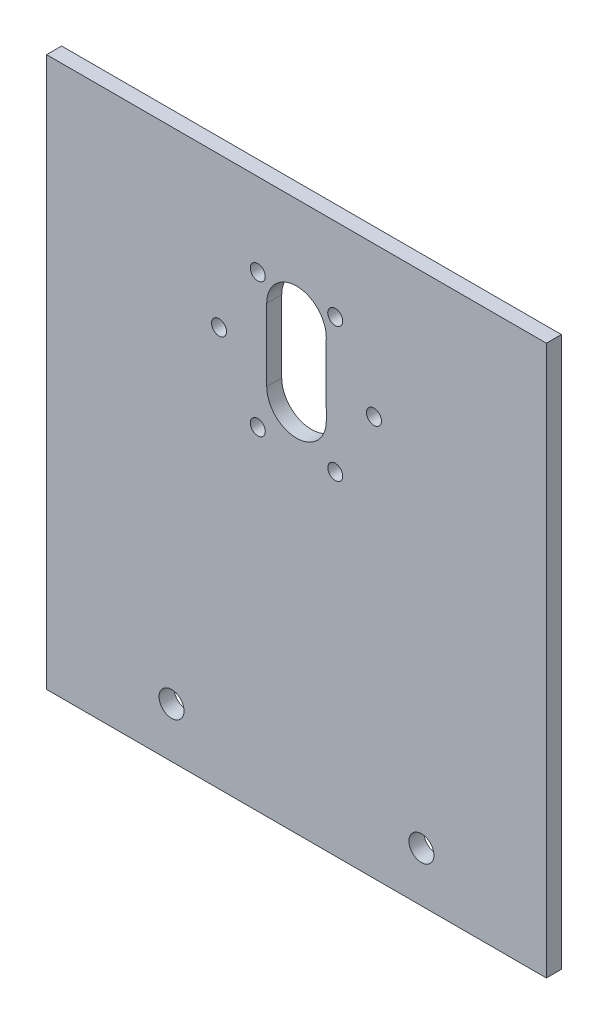
ISO-10303-21;
HEADER;
FILE_DESCRIPTION(('STEP AP214'),'2;1');
FILE_NAME('part.step','',(''),(''),'','','');
FILE_SCHEMA(('AUTOMOTIVE_DESIGN { 1 0 10303 214 1 1 1 1 }'));
ENDSEC;
DATA;
#1=APPLICATION_CONTEXT('core data for automotive mechanical design processes');
#2=APPLICATION_PROTOCOL_DEFINITION('international standard','automotive_design',2000,#1);
#3=PRODUCT_CONTEXT('',#1,'mechanical');
#4=PRODUCT('Part','Part','',(#3));
#5=PRODUCT_RELATED_PRODUCT_CATEGORY('part','',(#4));
#6=PRODUCT_DEFINITION_FORMATION('','',#4);
#7=PRODUCT_DEFINITION_CONTEXT('part definition',#1,'design');
#8=PRODUCT_DEFINITION('design','',#6,#7);
#9=PRODUCT_DEFINITION_SHAPE('','',#8);
#10=(LENGTH_UNIT() NAMED_UNIT(*) SI_UNIT(.MILLI.,.METRE.));
#11=(NAMED_UNIT(*) PLANE_ANGLE_UNIT() SI_UNIT($,.RADIAN.));
#12=(NAMED_UNIT(*) SI_UNIT($,.STERADIAN.) SOLID_ANGLE_UNIT());
#13=UNCERTAINTY_MEASURE_WITH_UNIT(LENGTH_MEASURE(1.E-05),#10,'distance_accuracy_value','');
#14=(GEOMETRIC_REPRESENTATION_CONTEXT(3) GLOBAL_UNCERTAINTY_ASSIGNED_CONTEXT((#13)) GLOBAL_UNIT_ASSIGNED_CONTEXT((#10,
#11,#12)) REPRESENTATION_CONTEXT('',''));
#15=CARTESIAN_POINT('',(0.,0.,0.));
#16=DIRECTION('',(0.,0.,1.));
#17=DIRECTION('',(1.,0.,0.));
#18=AXIS2_PLACEMENT_3D('',#15,#16,#17);
#19=CARTESIAN_POINT('',(0.,0.,3.));
#20=DIRECTION('',(0.,0.,1.));
#21=DIRECTION('',(1.,0.,0.));
#22=AXIS2_PLACEMENT_3D('',#19,#20,#21);
#23=PLANE('',#22);
#24=CARTESIAN_POINT('',(7.75242195535251,11.5780045579159,3.));
#25=DIRECTION('',(0.,0.,1.));
#26=DIRECTION('',(1.,0.,0.));
#27=AXIS2_PLACEMENT_3D('',#24,#25,#26);
#28=CIRCLE('',#27,1.5);
#29=CARTESIAN_POINT('',(9.25242195535251,11.5780045579159,3.));
#30=VERTEX_POINT('',#29);
#31=EDGE_CURVE('E317',#30,#30,#28,.T.);
#32=ORIENTED_EDGE('',*,*,#31,.F.);
#33=EDGE_LOOP('',(#32));
#34=FACE_BOUND('',#33,.T.);
#35=CARTESIAN_POINT('',(7.7475780446475,38.4247920752336,3.));
#36=DIRECTION('',(0.,0.,1.));
#37=DIRECTION('',(1.,0.,0.));
#38=AXIS2_PLACEMENT_3D('',#35,#36,#37);
#39=CIRCLE('',#38,1.5);
#40=CARTESIAN_POINT('',(9.2475780446475,38.4247920752336,3.));
#41=VERTEX_POINT('',#40);
#42=EDGE_CURVE('E333',#41,#41,#39,.T.);
#43=ORIENTED_EDGE('',*,*,#42,.F.);
#44=EDGE_LOOP('',(#43));
#45=FACE_BOUND('',#44,.T.);
#46=CARTESIAN_POINT('',(-15.5,24.9972033668504,3.));
#47=DIRECTION('',(0.,0.,1.));
#48=DIRECTION('',(1.,0.,0.));
#49=AXIS2_PLACEMENT_3D('',#46,#47,#48);
#50=CIRCLE('',#49,1.5);
#51=CARTESIAN_POINT('',(-14.,24.9972033668504,3.));
#52=VERTEX_POINT('',#51);
#53=EDGE_CURVE('E140',#52,#52,#50,.T.);
#54=ORIENTED_EDGE('',*,*,#53,.F.);
#55=EDGE_LOOP('',(#54));
#56=FACE_BOUND('',#55,.T.);
#57=CARTESIAN_POINT('',(-25.,-45.,3.));
#58=DIRECTION('',(0.,0.,1.));
#59=DIRECTION('',(1.,0.,0.));
#60=AXIS2_PLACEMENT_3D('',#57,#58,#59);
#61=CIRCLE('',#60,2.5);
#62=CARTESIAN_POINT('',(-22.5,-45.,3.));
#63=VERTEX_POINT('',#62);
#64=EDGE_CURVE('E164',#63,#63,#61,.T.);
#65=ORIENTED_EDGE('',*,*,#64,.F.);
#66=EDGE_LOOP('',(#65));
#67=FACE_BOUND('',#66,.T.);
#68=DIRECTION('',(0.,-1.,0.));
#69=VECTOR('',#68,1.);
#70=CARTESIAN_POINT('',(-50.,-55.,3.));
#71=LINE('',#70,#69);
#72=CARTESIAN_POINT('',(-50.,55.,3.));
#73=VERTEX_POINT('',#72);
#74=CARTESIAN_POINT('',(-50.,-55.,3.));
#75=VERTEX_POINT('',#74);
#76=EDGE_CURVE('E172',#73,#75,#71,.T.);
#77=ORIENTED_EDGE('',*,*,#76,.T.);
#78=DIRECTION('',(1.,0.,0.));
#79=VECTOR('',#78,1.);
#80=CARTESIAN_POINT('',(50.,-55.,3.));
#81=LINE('',#80,#79);
#82=CARTESIAN_POINT('',(50.,-55.,3.));
#83=VERTEX_POINT('',#82);
#84=EDGE_CURVE('E176',#75,#83,#81,.T.);
#85=ORIENTED_EDGE('',*,*,#84,.T.);
#86=DIRECTION('',(0.,1.,0.));
#87=VECTOR('',#86,1.);
#88=CARTESIAN_POINT('',(50.,-55.,3.));
#89=LINE('',#88,#87);
#90=CARTESIAN_POINT('',(50.,55.,3.));
#91=VERTEX_POINT('',#90);
#92=EDGE_CURVE('E180',#83,#91,#89,.T.);
#93=ORIENTED_EDGE('',*,*,#92,.T.);
#94=DIRECTION('',(-1.,0.,0.));
#95=VECTOR('',#94,1.);
#96=CARTESIAN_POINT('',(50.,55.,3.));
#97=LINE('',#96,#95);
#98=EDGE_CURVE('E183',#91,#73,#97,.T.);
#99=ORIENTED_EDGE('',*,*,#98,.T.);
#100=EDGE_LOOP('',(#77,#85,#93,#99));
#101=FACE_BOUND('',#100,.T.);
#102=CARTESIAN_POINT('',(25.,-45.,3.));
#103=DIRECTION('',(0.,0.,1.));
#104=DIRECTION('',(1.,0.,0.));
#105=AXIS2_PLACEMENT_3D('',#102,#103,#104);
#106=CIRCLE('',#105,2.5);
#107=CARTESIAN_POINT('',(27.5,-45.,3.));
#108=VERTEX_POINT('',#107);
#109=EDGE_CURVE('E156',#108,#108,#106,.T.);
#110=ORIENTED_EDGE('',*,*,#109,.F.);
#111=EDGE_LOOP('',(#110));
#112=FACE_BOUND('',#111,.T.);
#113=DIRECTION('',(-0.00355927963960998,0.999993665744162,0.));
#114=VECTOR('',#113,1.);
#115=CARTESIAN_POINT('',(5.91087650734295,33.1850525693656,3.));
#116=LINE('',#115,#114);
#117=CARTESIAN_POINT('',(5.95949046388291,19.5267695657713,3.));
#118=VERTEX_POINT('',#117);
#119=CARTESIAN_POINT('',(5.91087650734295,33.1850525693656,3.));
#120=VERTEX_POINT('',#119);
#121=EDGE_CURVE('E114',#118,#120,#116,.T.);
#122=ORIENTED_EDGE('',*,*,#121,.F.);
#123=CARTESIAN_POINT('',(0.,19.5055579383409,3.));
#124=DIRECTION('',(0.,0.,1.));
#125=DIRECTION('',(1.,0.,0.));
#126=AXIS2_PLACEMENT_3D('',#123,#124,#125);
#127=CIRCLE('',#126,5.95952821305928);
#128=CARTESIAN_POINT('',(-5.95952821305927,19.5055579383409,3.));
#129=VERTEX_POINT('',#128);
#130=EDGE_CURVE('E105',#129,#118,#127,.T.);
#131=ORIENTED_EDGE('',*,*,#130,.F.);
#132=DIRECTION('',(0.,-1.,0.));
#133=VECTOR('',#132,1.);
#134=CARTESIAN_POINT('',(-5.95952821305928,33.9449969339021,3.));
#135=LINE('',#134,#133);
#136=CARTESIAN_POINT('',(-5.95952821305928,33.9449969339021,3.));
#137=VERTEX_POINT('',#136);
#138=EDGE_CURVE('E132',#137,#129,#135,.T.);
#139=ORIENTED_EDGE('',*,*,#138,.F.);
#140=CARTESIAN_POINT('',(0.,33.9449969339021,3.));
#141=DIRECTION('',(0.,0.,1.));
#142=DIRECTION('',(1.,0.,0.));
#143=AXIS2_PLACEMENT_3D('',#140,#141,#142);
#144=CIRCLE('',#143,5.95952821305928);
#145=EDGE_CURVE('E128',#120,#137,#144,.T.);
#146=ORIENTED_EDGE('',*,*,#145,.F.);
#147=EDGE_LOOP('',(#122,#131,#139,#146));
#148=FACE_BOUND('',#147,.T.);
#149=CARTESIAN_POINT('',(-7.75242195535255,38.4219954420841,3.));
#150=DIRECTION('',(0.,0.,1.));
#151=DIRECTION('',(1.,0.,0.));
#152=AXIS2_PLACEMENT_3D('',#149,#150,#151);
#153=CIRCLE('',#152,1.5);
#154=CARTESIAN_POINT('',(-6.25242195535256,38.4219954420841,3.));
#155=VERTEX_POINT('',#154);
#156=EDGE_CURVE('E341',#155,#155,#153,.T.);
#157=ORIENTED_EDGE('',*,*,#156,.F.);
#158=EDGE_LOOP('',(#157));
#159=FACE_BOUND('',#158,.T.);
#160=CARTESIAN_POINT('',(15.5,25.0027966331495,3.));
#161=DIRECTION('',(0.,0.,1.));
#162=DIRECTION('',(1.,0.,0.));
#163=AXIS2_PLACEMENT_3D('',#160,#161,#162);
#164=CIRCLE('',#163,1.5);
#165=CARTESIAN_POINT('',(17.,25.0027966331495,3.));
#166=VERTEX_POINT('',#165);
#167=EDGE_CURVE('E325',#166,#166,#164,.T.);
#168=ORIENTED_EDGE('',*,*,#167,.F.);
#169=EDGE_LOOP('',(#168));
#170=FACE_BOUND('',#169,.T.);
#171=CARTESIAN_POINT('',(-7.74757804464754,11.5752079247665,3.));
#172=DIRECTION('',(0.,0.,1.));
#173=DIRECTION('',(1.,0.,0.));
#174=AXIS2_PLACEMENT_3D('',#171,#172,#173);
#175=CIRCLE('',#174,1.5);
#176=CARTESIAN_POINT('',(-6.24757804464754,11.5752079247665,3.));
#177=VERTEX_POINT('',#176);
#178=EDGE_CURVE('E306',#177,#177,#175,.T.);
#179=ORIENTED_EDGE('',*,*,#178,.F.);
#180=EDGE_LOOP('',(#179));
#181=FACE_BOUND('',#180,.T.);
#182=ADVANCED_FACE('F39',(#34,#45,#56,#67,#101,#112,#148,#159,#170,#181),#23,.T.);
#183=CARTESIAN_POINT('',(0.,0.,0.));
#184=DIRECTION('',(0.,0.,1.));
#185=DIRECTION('',(1.,0.,0.));
#186=AXIS2_PLACEMENT_3D('',#183,#184,#185);
#187=PLANE('',#186);
#188=CARTESIAN_POINT('',(25.,-45.,0.));
#189=DIRECTION('',(0.,0.,1.));
#190=DIRECTION('',(1.,0.,0.));
#191=AXIS2_PLACEMENT_3D('',#188,#189,#190);
#192=CIRCLE('',#191,2.5);
#193=CARTESIAN_POINT('',(27.5,-45.,0.));
#194=VERTEX_POINT('',#193);
#195=EDGE_CURVE('E123',#194,#194,#192,.T.);
#196=ORIENTED_EDGE('',*,*,#195,.T.);
#197=EDGE_LOOP('',(#196));
#198=FACE_BOUND('',#197,.T.);
#199=CARTESIAN_POINT('',(-25.,-45.,0.));
#200=DIRECTION('',(0.,0.,1.));
#201=DIRECTION('',(1.,0.,0.));
#202=AXIS2_PLACEMENT_3D('',#199,#200,#201);
#203=CIRCLE('',#202,2.5);
#204=CARTESIAN_POINT('',(-22.5,-45.,0.));
#205=VERTEX_POINT('',#204);
#206=EDGE_CURVE('E160',#205,#205,#203,.T.);
#207=ORIENTED_EDGE('',*,*,#206,.T.);
#208=EDGE_LOOP('',(#207));
#209=FACE_BOUND('',#208,.T.);
#210=DIRECTION('',(0.,-1.,0.));
#211=VECTOR('',#210,1.);
#212=CARTESIAN_POINT('',(-50.,-55.,0.));
#213=LINE('',#212,#211);
#214=CARTESIAN_POINT('',(-50.,55.,0.));
#215=VERTEX_POINT('',#214);
#216=CARTESIAN_POINT('',(-50.,-55.,0.));
#217=VERTEX_POINT('',#216);
#218=EDGE_CURVE('E168',#215,#217,#213,.T.);
#219=ORIENTED_EDGE('',*,*,#218,.F.);
#220=DIRECTION('',(-1.,0.,0.));
#221=VECTOR('',#220,1.);
#222=CARTESIAN_POINT('',(50.,55.,0.));
#223=LINE('',#222,#221);
#224=CARTESIAN_POINT('',(50.,55.,0.));
#225=VERTEX_POINT('',#224);
#226=EDGE_CURVE('E177',#225,#215,#223,.T.);
#227=ORIENTED_EDGE('',*,*,#226,.F.);
#228=DIRECTION('',(0.,1.,0.));
#229=VECTOR('',#228,1.);
#230=CARTESIAN_POINT('',(50.,-55.,0.));
#231=LINE('',#230,#229);
#232=CARTESIAN_POINT('',(50.,-55.,0.));
#233=VERTEX_POINT('',#232);
#234=EDGE_CURVE('E193',#233,#225,#231,.T.);
#235=ORIENTED_EDGE('',*,*,#234,.F.);
#236=DIRECTION('',(1.,0.,0.));
#237=VECTOR('',#236,1.);
#238=CARTESIAN_POINT('',(50.,-55.,0.));
#239=LINE('',#238,#237);
#240=EDGE_CURVE('E190',#217,#233,#239,.T.);
#241=ORIENTED_EDGE('',*,*,#240,.F.);
#242=EDGE_LOOP('',(#219,#227,#235,#241));
#243=FACE_BOUND('',#242,.T.);
#244=CARTESIAN_POINT('',(0.,19.5055579383409,0.));
#245=DIRECTION('',(0.,0.,1.));
#246=DIRECTION('',(1.,0.,0.));
#247=AXIS2_PLACEMENT_3D('',#244,#245,#246);
#248=CIRCLE('',#247,5.95952821305928);
#249=CARTESIAN_POINT('',(-5.95952821305927,19.5055579383409,0.));
#250=VERTEX_POINT('',#249);
#251=CARTESIAN_POINT('',(5.95949046388291,19.5267695657713,0.));
#252=VERTEX_POINT('',#251);
#253=EDGE_CURVE('E63',#250,#252,#248,.T.);
#254=ORIENTED_EDGE('',*,*,#253,.T.);
#255=DIRECTION('',(-0.00355927963960998,0.999993665744162,0.));
#256=VECTOR('',#255,1.);
#257=CARTESIAN_POINT('',(5.91087650734295,33.1850525693656,0.));
#258=LINE('',#257,#256);
#259=CARTESIAN_POINT('',(5.91087650734295,33.1850525693656,0.));
#260=VERTEX_POINT('',#259);
#261=EDGE_CURVE('E121',#252,#260,#258,.T.);
#262=ORIENTED_EDGE('',*,*,#261,.T.);
#263=CARTESIAN_POINT('',(0.,33.9449969339021,0.));
#264=DIRECTION('',(0.,0.,1.));
#265=DIRECTION('',(1.,0.,0.));
#266=AXIS2_PLACEMENT_3D('',#263,#264,#265);
#267=CIRCLE('',#266,5.95952821305928);
#268=CARTESIAN_POINT('',(-5.95952821305927,33.9449969339021,0.));
#269=VERTEX_POINT('',#268);
#270=EDGE_CURVE('E143',#260,#269,#267,.T.);
#271=ORIENTED_EDGE('',*,*,#270,.T.);
#272=DIRECTION('',(0.,-1.,0.));
#273=VECTOR('',#272,1.);
#274=CARTESIAN_POINT('',(-5.95952821305928,33.9449969339021,0.));
#275=LINE('',#274,#273);
#276=EDGE_CURVE('E115',#269,#250,#275,.T.);
#277=ORIENTED_EDGE('',*,*,#276,.T.);
#278=EDGE_LOOP('',(#254,#262,#271,#277));
#279=FACE_BOUND('',#278,.T.);
#280=CARTESIAN_POINT('',(-15.5,24.9972033668504,0.));
#281=DIRECTION('',(0.,0.,1.));
#282=DIRECTION('',(1.,0.,0.));
#283=AXIS2_PLACEMENT_3D('',#280,#281,#282);
#284=CIRCLE('',#283,1.5);
#285=CARTESIAN_POINT('',(-14.,24.9972033668504,0.));
#286=VERTEX_POINT('',#285);
#287=EDGE_CURVE('E345',#286,#286,#284,.T.);
#288=ORIENTED_EDGE('',*,*,#287,.T.);
#289=EDGE_LOOP('',(#288));
#290=FACE_BOUND('',#289,.T.);
#291=CARTESIAN_POINT('',(-7.75242195535255,38.4219954420841,0.));
#292=DIRECTION('',(0.,0.,1.));
#293=DIRECTION('',(1.,0.,0.));
#294=AXIS2_PLACEMENT_3D('',#291,#292,#293);
#295=CIRCLE('',#294,1.5);
#296=CARTESIAN_POINT('',(-6.25242195535256,38.4219954420841,0.));
#297=VERTEX_POINT('',#296);
#298=EDGE_CURVE('E337',#297,#297,#295,.T.);
#299=ORIENTED_EDGE('',*,*,#298,.T.);
#300=EDGE_LOOP('',(#299));
#301=FACE_BOUND('',#300,.T.);
#302=CARTESIAN_POINT('',(7.7475780446475,38.4247920752336,0.));
#303=DIRECTION('',(0.,0.,1.));
#304=DIRECTION('',(1.,0.,0.));
#305=AXIS2_PLACEMENT_3D('',#302,#303,#304);
#306=CIRCLE('',#305,1.5);
#307=CARTESIAN_POINT('',(9.2475780446475,38.4247920752336,0.));
#308=VERTEX_POINT('',#307);
#309=EDGE_CURVE('E329',#308,#308,#306,.T.);
#310=ORIENTED_EDGE('',*,*,#309,.T.);
#311=EDGE_LOOP('',(#310));
#312=FACE_BOUND('',#311,.T.);
#313=CARTESIAN_POINT('',(15.5,25.0027966331495,0.));
#314=DIRECTION('',(0.,0.,1.));
#315=DIRECTION('',(1.,0.,0.));
#316=AXIS2_PLACEMENT_3D('',#313,#314,#315);
#317=CIRCLE('',#316,1.5);
#318=CARTESIAN_POINT('',(17.,25.0027966331495,0.));
#319=VERTEX_POINT('',#318);
#320=EDGE_CURVE('E321',#319,#319,#317,.T.);
#321=ORIENTED_EDGE('',*,*,#320,.T.);
#322=EDGE_LOOP('',(#321));
#323=FACE_BOUND('',#322,.T.);
#324=CARTESIAN_POINT('',(7.75242195535251,11.5780045579159,0.));
#325=DIRECTION('',(0.,0.,1.));
#326=DIRECTION('',(1.,0.,0.));
#327=AXIS2_PLACEMENT_3D('',#324,#325,#326);
#328=CIRCLE('',#327,1.5);
#329=CARTESIAN_POINT('',(9.25242195535251,11.5780045579159,0.));
#330=VERTEX_POINT('',#329);
#331=EDGE_CURVE('E314',#330,#330,#328,.T.);
#332=ORIENTED_EDGE('',*,*,#331,.T.);
#333=EDGE_LOOP('',(#332));
#334=FACE_BOUND('',#333,.T.);
#335=CARTESIAN_POINT('',(-7.74757804464754,11.5752079247665,0.));
#336=DIRECTION('',(0.,0.,1.));
#337=DIRECTION('',(1.,0.,0.));
#338=AXIS2_PLACEMENT_3D('',#335,#336,#337);
#339=CIRCLE('',#338,1.5);
#340=CARTESIAN_POINT('',(-6.24757804464754,11.5752079247665,0.));
#341=VERTEX_POINT('',#340);
#342=EDGE_CURVE('E309',#341,#341,#339,.T.);
#343=ORIENTED_EDGE('',*,*,#342,.T.);
#344=EDGE_LOOP('',(#343));
#345=FACE_BOUND('',#344,.T.);
#346=ADVANCED_FACE('F216',(#198,#209,#243,#279,#290,#301,#312,#323,#334,#345),#187,.F.);
#347=CARTESIAN_POINT('',(-50.,-55.,3.));
#348=DIRECTION('',(1.,0.,0.));
#349=DIRECTION('',(0.,0.,-1.));
#350=AXIS2_PLACEMENT_3D('',#347,#348,#349);
#351=PLANE('',#350);
#352=ORIENTED_EDGE('',*,*,#218,.T.);
#353=DIRECTION('',(0.,0.,-1.));
#354=VECTOR('',#353,1.);
#355=CARTESIAN_POINT('',(-50.,-55.,3.));
#356=LINE('',#355,#354);
#357=EDGE_CURVE('E11',#75,#217,#356,.T.);
#358=ORIENTED_EDGE('',*,*,#357,.F.);
#359=ORIENTED_EDGE('',*,*,#76,.F.);
#360=DIRECTION('',(0.,0.,-1.));
#361=VECTOR('',#360,1.);
#362=CARTESIAN_POINT('',(-50.,55.,3.));
#363=LINE('',#362,#361);
#364=EDGE_CURVE('E186',#73,#215,#363,.T.);
#365=ORIENTED_EDGE('',*,*,#364,.T.);
#366=EDGE_LOOP('',(#352,#358,#359,#365));
#367=FACE_BOUND('',#366,.T.);
#368=ADVANCED_FACE('F41',(#367),#351,.F.);
#369=CARTESIAN_POINT('',(50.,-55.,3.));
#370=DIRECTION('',(0.,1.,0.));
#371=DIRECTION('',(-1.,0.,0.));
#372=AXIS2_PLACEMENT_3D('',#369,#370,#371);
#373=PLANE('',#372);
#374=ORIENTED_EDGE('',*,*,#240,.T.);
#375=DIRECTION('',(0.,0.,-1.));
#376=VECTOR('',#375,1.);
#377=CARTESIAN_POINT('',(50.,-55.,3.));
#378=LINE('',#377,#376);
#379=EDGE_CURVE('E48',#83,#233,#378,.T.);
#380=ORIENTED_EDGE('',*,*,#379,.F.);
#381=ORIENTED_EDGE('',*,*,#84,.F.);
#382=ORIENTED_EDGE('',*,*,#357,.T.);
#383=EDGE_LOOP('',(#374,#380,#381,#382));
#384=FACE_BOUND('',#383,.T.);
#385=ADVANCED_FACE('F227',(#384),#373,.F.);
#386=CARTESIAN_POINT('',(50.,-55.,3.));
#387=DIRECTION('',(-1.,0.,0.));
#388=DIRECTION('',(0.,-1.,0.));
#389=AXIS2_PLACEMENT_3D('',#386,#387,#388);
#390=PLANE('',#389);
#391=ORIENTED_EDGE('',*,*,#234,.T.);
#392=DIRECTION('',(0.,0.,-1.));
#393=VECTOR('',#392,1.);
#394=CARTESIAN_POINT('',(50.,55.,3.));
#395=LINE('',#394,#393);
#396=EDGE_CURVE('E201',#91,#225,#395,.T.);
#397=ORIENTED_EDGE('',*,*,#396,.F.);
#398=ORIENTED_EDGE('',*,*,#92,.F.);
#399=ORIENTED_EDGE('',*,*,#379,.T.);
#400=EDGE_LOOP('',(#391,#397,#398,#399));
#401=FACE_BOUND('',#400,.T.);
#402=ADVANCED_FACE('F210',(#401),#390,.F.);
#403=CARTESIAN_POINT('',(50.,55.,3.));
#404=DIRECTION('',(0.,-1.,0.));
#405=DIRECTION('',(1.,0.,0.));
#406=AXIS2_PLACEMENT_3D('',#403,#404,#405);
#407=PLANE('',#406);
#408=ORIENTED_EDGE('',*,*,#226,.T.);
#409=ORIENTED_EDGE('',*,*,#364,.F.);
#410=ORIENTED_EDGE('',*,*,#98,.F.);
#411=ORIENTED_EDGE('',*,*,#396,.T.);
#412=EDGE_LOOP('',(#408,#409,#410,#411));
#413=FACE_BOUND('',#412,.T.);
#414=ADVANCED_FACE('F220',(#413),#407,.F.);
#415=CARTESIAN_POINT('',(-25.,-45.,3.));
#416=DIRECTION('',(0.,0.,-1.));
#417=DIRECTION('',(-1.,0.,0.));
#418=AXIS2_PLACEMENT_3D('',#415,#416,#417);
#419=CYLINDRICAL_SURFACE('',#418,2.5);
#420=ORIENTED_EDGE('',*,*,#64,.T.);
#421=EDGE_LOOP('',(#420));
#422=FACE_BOUND('',#421,.T.);
#423=ORIENTED_EDGE('',*,*,#206,.F.);
#424=EDGE_LOOP('',(#423));
#425=FACE_BOUND('',#424,.T.);
#426=ADVANCED_FACE('F245',(#422,#425),#419,.F.);
#427=CARTESIAN_POINT('',(25.,-45.,3.));
#428=DIRECTION('',(0.,0.,-1.));
#429=DIRECTION('',(-1.,0.,0.));
#430=AXIS2_PLACEMENT_3D('',#427,#428,#429);
#431=CYLINDRICAL_SURFACE('',#430,2.5);
#432=ORIENTED_EDGE('',*,*,#109,.T.);
#433=EDGE_LOOP('',(#432));
#434=FACE_BOUND('',#433,.T.);
#435=ORIENTED_EDGE('',*,*,#195,.F.);
#436=EDGE_LOOP('',(#435));
#437=FACE_BOUND('',#436,.T.);
#438=ADVANCED_FACE('F252',(#434,#437),#431,.F.);
#439=CARTESIAN_POINT('',(0.,19.5055579383409,3.));
#440=DIRECTION('',(0.,0.,-1.));
#441=DIRECTION('',(-1.,0.,0.));
#442=AXIS2_PLACEMENT_3D('',#439,#440,#441);
#443=CYLINDRICAL_SURFACE('',#442,5.95952821305928);
#444=ORIENTED_EDGE('',*,*,#253,.F.);
#445=DIRECTION('',(0.,0.,-1.));
#446=VECTOR('',#445,1.);
#447=CARTESIAN_POINT('',(-5.95952821305927,19.5055579383409,3.));
#448=LINE('',#447,#446);
#449=EDGE_CURVE('E109',#129,#250,#448,.T.);
#450=ORIENTED_EDGE('',*,*,#449,.F.);
#451=ORIENTED_EDGE('',*,*,#130,.T.);
#452=DIRECTION('',(0.,0.,-1.));
#453=VECTOR('',#452,1.);
#454=CARTESIAN_POINT('',(5.95949046388291,19.5267695657713,3.));
#455=LINE('',#454,#453);
#456=EDGE_CURVE('E108',#118,#252,#455,.T.);
#457=ORIENTED_EDGE('',*,*,#456,.T.);
#458=EDGE_LOOP('',(#444,#450,#451,#457));
#459=FACE_BOUND('',#458,.T.);
#460=ADVANCED_FACE('F107',(#459),#443,.F.);
#461=CARTESIAN_POINT('',(5.91087650734295,33.1850525693656,3.));
#462=DIRECTION('',(-0.999993665744162,-0.00355927963960998,0.));
#463=DIRECTION('',(0.00355927963960998,-0.999993665744162,0.));
#464=AXIS2_PLACEMENT_3D('',#461,#462,#463);
#465=PLANE('',#464);
#466=ORIENTED_EDGE('',*,*,#261,.F.);
#467=ORIENTED_EDGE('',*,*,#456,.F.);
#468=ORIENTED_EDGE('',*,*,#121,.T.);
#469=DIRECTION('',(0.,0.,-1.));
#470=VECTOR('',#469,1.);
#471=CARTESIAN_POINT('',(5.91087650734295,33.1850525693656,3.));
#472=LINE('',#471,#470);
#473=EDGE_CURVE('E124',#120,#260,#472,.T.);
#474=ORIENTED_EDGE('',*,*,#473,.T.);
#475=EDGE_LOOP('',(#466,#467,#468,#474));
#476=FACE_BOUND('',#475,.T.);
#477=ADVANCED_FACE('F118',(#476),#465,.T.);
#478=CARTESIAN_POINT('',(0.,33.9449969339021,3.));
#479=DIRECTION('',(0.,0.,-1.));
#480=DIRECTION('',(-1.,0.,0.));
#481=AXIS2_PLACEMENT_3D('',#478,#479,#480);
#482=CYLINDRICAL_SURFACE('',#481,5.95952821305928);
#483=ORIENTED_EDGE('',*,*,#270,.F.);
#484=ORIENTED_EDGE('',*,*,#473,.F.);
#485=ORIENTED_EDGE('',*,*,#145,.T.);
#486=DIRECTION('',(0.,0.,-1.));
#487=VECTOR('',#486,1.);
#488=CARTESIAN_POINT('',(-5.95952821305927,33.9449969339021,3.));
#489=LINE('',#488,#487);
#490=EDGE_CURVE('E55',#137,#269,#489,.T.);
#491=ORIENTED_EDGE('',*,*,#490,.T.);
#492=EDGE_LOOP('',(#483,#484,#485,#491));
#493=FACE_BOUND('',#492,.T.);
#494=ADVANCED_FACE('F271',(#493),#482,.F.);
#495=CARTESIAN_POINT('',(-5.95952821305928,33.9449969339021,3.));
#496=DIRECTION('',(1.,0.,0.));
#497=DIRECTION('',(0.,1.,0.));
#498=AXIS2_PLACEMENT_3D('',#495,#496,#497);
#499=PLANE('',#498);
#500=ORIENTED_EDGE('',*,*,#276,.F.);
#501=ORIENTED_EDGE('',*,*,#490,.F.);
#502=ORIENTED_EDGE('',*,*,#138,.T.);
#503=ORIENTED_EDGE('',*,*,#449,.T.);
#504=EDGE_LOOP('',(#500,#501,#502,#503));
#505=FACE_BOUND('',#504,.T.);
#506=ADVANCED_FACE('F274',(#505),#499,.T.);
#507=CARTESIAN_POINT('',(-15.5,24.9972033668504,3.));
#508=DIRECTION('',(0.,0.,-1.));
#509=DIRECTION('',(-1.,0.,0.));
#510=AXIS2_PLACEMENT_3D('',#507,#508,#509);
#511=CYLINDRICAL_SURFACE('',#510,1.5);
#512=ORIENTED_EDGE('',*,*,#53,.T.);
#513=EDGE_LOOP('',(#512));
#514=FACE_BOUND('',#513,.T.);
#515=ORIENTED_EDGE('',*,*,#287,.F.);
#516=EDGE_LOOP('',(#515));
#517=FACE_BOUND('',#516,.T.);
#518=ADVANCED_FACE('F278',(#514,#517),#511,.F.);
#519=CARTESIAN_POINT('',(-7.75242195535255,38.4219954420841,3.));
#520=DIRECTION('',(0.,0.,-1.));
#521=DIRECTION('',(-1.,0.,0.));
#522=AXIS2_PLACEMENT_3D('',#519,#520,#521);
#523=CYLINDRICAL_SURFACE('',#522,1.5);
#524=ORIENTED_EDGE('',*,*,#156,.T.);
#525=EDGE_LOOP('',(#524));
#526=FACE_BOUND('',#525,.T.);
#527=ORIENTED_EDGE('',*,*,#298,.F.);
#528=EDGE_LOOP('',(#527));
#529=FACE_BOUND('',#528,.T.);
#530=ADVANCED_FACE('F281',(#526,#529),#523,.F.);
#531=CARTESIAN_POINT('',(7.7475780446475,38.4247920752336,3.));
#532=DIRECTION('',(0.,0.,-1.));
#533=DIRECTION('',(-1.,0.,0.));
#534=AXIS2_PLACEMENT_3D('',#531,#532,#533);
#535=CYLINDRICAL_SURFACE('',#534,1.5);
#536=ORIENTED_EDGE('',*,*,#42,.T.);
#537=EDGE_LOOP('',(#536));
#538=FACE_BOUND('',#537,.T.);
#539=ORIENTED_EDGE('',*,*,#309,.F.);
#540=EDGE_LOOP('',(#539));
#541=FACE_BOUND('',#540,.T.);
#542=ADVANCED_FACE('F285',(#538,#541),#535,.F.);
#543=CARTESIAN_POINT('',(15.5,25.0027966331495,3.));
#544=DIRECTION('',(0.,0.,-1.));
#545=DIRECTION('',(-1.,0.,0.));
#546=AXIS2_PLACEMENT_3D('',#543,#544,#545);
#547=CYLINDRICAL_SURFACE('',#546,1.5);
#548=ORIENTED_EDGE('',*,*,#167,.T.);
#549=EDGE_LOOP('',(#548));
#550=FACE_BOUND('',#549,.T.);
#551=ORIENTED_EDGE('',*,*,#320,.F.);
#552=EDGE_LOOP('',(#551));
#553=FACE_BOUND('',#552,.T.);
#554=ADVANCED_FACE('F289',(#550,#553),#547,.F.);
#555=CARTESIAN_POINT('',(7.75242195535251,11.5780045579159,3.));
#556=DIRECTION('',(0.,0.,-1.));
#557=DIRECTION('',(-1.,0.,0.));
#558=AXIS2_PLACEMENT_3D('',#555,#556,#557);
#559=CYLINDRICAL_SURFACE('',#558,1.5);
#560=ORIENTED_EDGE('',*,*,#31,.T.);
#561=EDGE_LOOP('',(#560));
#562=FACE_BOUND('',#561,.T.);
#563=ORIENTED_EDGE('',*,*,#331,.F.);
#564=EDGE_LOOP('',(#563));
#565=FACE_BOUND('',#564,.T.);
#566=ADVANCED_FACE('F293',(#562,#565),#559,.F.);
#567=CARTESIAN_POINT('',(-7.74757804464754,11.5752079247665,3.));
#568=DIRECTION('',(0.,0.,-1.));
#569=DIRECTION('',(-1.,0.,0.));
#570=AXIS2_PLACEMENT_3D('',#567,#568,#569);
#571=CYLINDRICAL_SURFACE('',#570,1.5);
#572=ORIENTED_EDGE('',*,*,#178,.T.);
#573=EDGE_LOOP('',(#572));
#574=FACE_BOUND('',#573,.T.);
#575=ORIENTED_EDGE('',*,*,#342,.F.);
#576=EDGE_LOOP('',(#575));
#577=FACE_BOUND('',#576,.T.);
#578=ADVANCED_FACE('F297',(#574,#577),#571,.F.);
#579=CLOSED_SHELL('',(#182,#346,#368,#385,#402,#414,#426,#438,#460,#477,#494,#506,#518,#530,
#542,#554,#566,#578));
#580=MANIFOLD_SOLID_BREP('B2',#579);
#581=ADVANCED_BREP_SHAPE_REPRESENTATION('',(#18,#580),#14);
#582=SHAPE_DEFINITION_REPRESENTATION(#9,#581);
ENDSEC;
END-ISO-10303-21;
